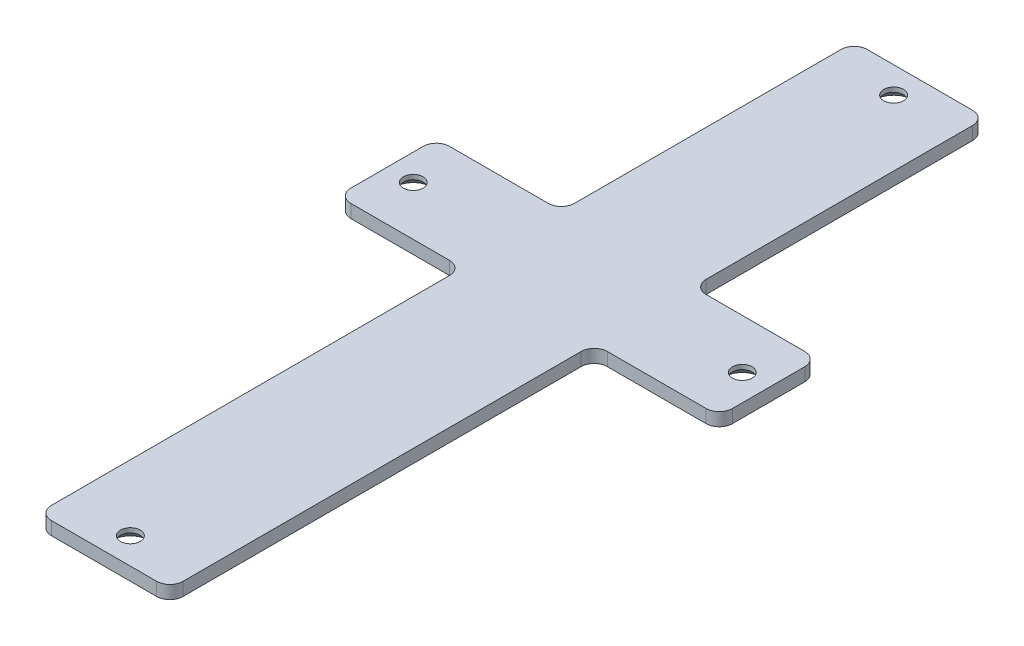
ISO-10303-21;
HEADER;
FILE_DESCRIPTION(('STEP AP214'),'2;1');
FILE_NAME('part.step','',(''),(''),'','','');
FILE_SCHEMA(('AUTOMOTIVE_DESIGN { 1 0 10303 214 1 1 1 1 }'));
ENDSEC;
DATA;
#1=APPLICATION_CONTEXT('core data for automotive mechanical design processes');
#2=APPLICATION_PROTOCOL_DEFINITION('international standard','automotive_design',2000,#1);
#3=PRODUCT_CONTEXT('',#1,'mechanical');
#4=PRODUCT('Part','Part','',(#3));
#5=PRODUCT_RELATED_PRODUCT_CATEGORY('part','',(#4));
#6=PRODUCT_DEFINITION_FORMATION('','',#4);
#7=PRODUCT_DEFINITION_CONTEXT('part definition',#1,'design');
#8=PRODUCT_DEFINITION('design','',#6,#7);
#9=PRODUCT_DEFINITION_SHAPE('','',#8);
#10=(LENGTH_UNIT() NAMED_UNIT(*) SI_UNIT(.MILLI.,.METRE.));
#11=(NAMED_UNIT(*) PLANE_ANGLE_UNIT() SI_UNIT($,.RADIAN.));
#12=(NAMED_UNIT(*) SI_UNIT($,.STERADIAN.) SOLID_ANGLE_UNIT());
#13=UNCERTAINTY_MEASURE_WITH_UNIT(LENGTH_MEASURE(1.E-05),#10,'distance_accuracy_value','');
#14=(GEOMETRIC_REPRESENTATION_CONTEXT(3) GLOBAL_UNCERTAINTY_ASSIGNED_CONTEXT((#13)) GLOBAL_UNIT_ASSIGNED_CONTEXT((#10,
#11,#12)) REPRESENTATION_CONTEXT('',''));
#15=CARTESIAN_POINT('',(0.,0.,0.));
#16=DIRECTION('',(0.,0.,1.));
#17=DIRECTION('',(1.,0.,0.));
#18=AXIS2_PLACEMENT_3D('',#15,#16,#17);
#19=CARTESIAN_POINT('',(0.,0.,0.));
#20=DIRECTION('',(0.,1.,0.));
#21=DIRECTION('',(0.,0.,1.));
#22=AXIS2_PLACEMENT_3D('',#19,#20,#21);
#23=PLANE('',#22);
#24=CARTESIAN_POINT('',(25.,0.,-10.));
#25=DIRECTION('',(0.,-1.,0.));
#26=DIRECTION('',(0.,0.,-1.));
#27=AXIS2_PLACEMENT_3D('',#24,#25,#26);
#28=CIRCLE('',#27,2.8);
#29=CARTESIAN_POINT('',(25.,0.,-12.8));
#30=VERTEX_POINT('',#29);
#31=EDGE_CURVE('E442',#30,#30,#28,.T.);
#32=ORIENTED_EDGE('',*,*,#31,.F.);
#33=EDGE_LOOP('',(#32));
#34=FACE_BOUND('',#33,.T.);
#35=CARTESIAN_POINT('',(0.,0.,-58.));
#36=DIRECTION('',(0.,-1.,0.));
#37=DIRECTION('',(0.,0.,-1.));
#38=AXIS2_PLACEMENT_3D('',#35,#36,#37);
#39=CIRCLE('',#38,2.8);
#40=CARTESIAN_POINT('',(0.,0.,-60.8));
#41=VERTEX_POINT('',#40);
#42=EDGE_CURVE('E424',#41,#41,#39,.T.);
#43=ORIENTED_EDGE('',*,*,#42,.F.);
#44=EDGE_LOOP('',(#43));
#45=FACE_BOUND('',#44,.T.);
#46=CARTESIAN_POINT('',(-12.,0.,-0.499999999999998));
#47=DIRECTION('',(0.,1.,0.));
#48=DIRECTION('',(0.,0.,1.));
#49=AXIS2_PLACEMENT_3D('',#46,#47,#48);
#50=CIRCLE('',#49,2.);
#51=CARTESIAN_POINT('',(-10.,0.,-0.499999999999984));
#52=VERTEX_POINT('',#51);
#53=CARTESIAN_POINT('',(-12.,0.,-2.5));
#54=VERTEX_POINT('',#53);
#55=EDGE_CURVE('E237',#52,#54,#50,.T.);
#56=ORIENTED_EDGE('',*,*,#55,.T.);
#57=DIRECTION('',(1.,0.,0.));
#58=VECTOR('',#57,1.);
#59=CARTESIAN_POINT('',(0.,0.,-2.5));
#60=LINE('',#59,#58);
#61=CARTESIAN_POINT('',(-27.,0.,-2.5));
#62=VERTEX_POINT('',#61);
#63=EDGE_CURVE('E297',#62,#54,#60,.T.);
#64=ORIENTED_EDGE('',*,*,#63,.F.);
#65=CARTESIAN_POINT('',(-27.,0.,-4.5));
#66=DIRECTION('',(0.,1.,0.));
#67=DIRECTION('',(0.,0.,1.));
#68=AXIS2_PLACEMENT_3D('',#65,#66,#67);
#69=CIRCLE('',#68,2.);
#70=CARTESIAN_POINT('',(-29.,0.,-4.50000000000001));
#71=VERTEX_POINT('',#70);
#72=EDGE_CURVE('E295',#62,#71,#69,.F.);
#73=ORIENTED_EDGE('',*,*,#72,.T.);
#74=DIRECTION('',(0.,0.,-1.));
#75=VECTOR('',#74,1.);
#76=CARTESIAN_POINT('',(-29.,0.,0.));
#77=LINE('',#76,#75);
#78=CARTESIAN_POINT('',(-29.,0.,-15.5));
#79=VERTEX_POINT('',#78);
#80=EDGE_CURVE('E205',#71,#79,#77,.T.);
#81=ORIENTED_EDGE('',*,*,#80,.T.);
#82=CARTESIAN_POINT('',(-27.,0.,-15.5));
#83=DIRECTION('',(0.,1.,0.));
#84=DIRECTION('',(0.,0.,1.));
#85=AXIS2_PLACEMENT_3D('',#82,#83,#84);
#86=CIRCLE('',#85,2.);
#87=CARTESIAN_POINT('',(-27.,0.,-17.5));
#88=VERTEX_POINT('',#87);
#89=EDGE_CURVE('E291',#79,#88,#86,.F.);
#90=ORIENTED_EDGE('',*,*,#89,.T.);
#91=DIRECTION('',(1.,0.,0.));
#92=VECTOR('',#91,1.);
#93=CARTESIAN_POINT('',(0.,0.,-17.5));
#94=LINE('',#93,#92);
#95=CARTESIAN_POINT('',(-12.,0.,-17.5));
#96=VERTEX_POINT('',#95);
#97=EDGE_CURVE('E288',#88,#96,#94,.T.);
#98=ORIENTED_EDGE('',*,*,#97,.T.);
#99=CARTESIAN_POINT('',(-12.,0.,-19.5));
#100=DIRECTION('',(0.,1.,0.));
#101=DIRECTION('',(0.,0.,1.));
#102=AXIS2_PLACEMENT_3D('',#99,#100,#101);
#103=CIRCLE('',#102,2.);
#104=CARTESIAN_POINT('',(-10.,0.,-19.5));
#105=VERTEX_POINT('',#104);
#106=EDGE_CURVE('E285',#96,#105,#103,.T.);
#107=ORIENTED_EDGE('',*,*,#106,.T.);
#108=DIRECTION('',(0.,0.,-1.));
#109=VECTOR('',#108,1.);
#110=CARTESIAN_POINT('',(-10.,0.,0.));
#111=LINE('',#110,#109);
#112=CARTESIAN_POINT('',(-10.,0.,-60.));
#113=VERTEX_POINT('',#112);
#114=EDGE_CURVE('E282',#105,#113,#111,.T.);
#115=ORIENTED_EDGE('',*,*,#114,.T.);
#116=CARTESIAN_POINT('',(-8.,0.,-60.));
#117=DIRECTION('',(0.,1.,0.));
#118=DIRECTION('',(0.,0.,1.));
#119=AXIS2_PLACEMENT_3D('',#116,#117,#118);
#120=CIRCLE('',#119,2.);
#121=CARTESIAN_POINT('',(-7.99999999999998,0.,-62.));
#122=VERTEX_POINT('',#121);
#123=EDGE_CURVE('E279',#113,#122,#120,.F.);
#124=ORIENTED_EDGE('',*,*,#123,.T.);
#125=DIRECTION('',(1.,0.,0.));
#126=VECTOR('',#125,1.);
#127=CARTESIAN_POINT('',(0.,0.,-62.));
#128=LINE('',#127,#126);
#129=CARTESIAN_POINT('',(7.99999999999999,0.,-62.));
#130=VERTEX_POINT('',#129);
#131=EDGE_CURVE('E276',#122,#130,#128,.T.);
#132=ORIENTED_EDGE('',*,*,#131,.T.);
#133=CARTESIAN_POINT('',(8.,0.,-60.));
#134=DIRECTION('',(0.,1.,0.));
#135=DIRECTION('',(0.,0.,1.));
#136=AXIS2_PLACEMENT_3D('',#133,#134,#135);
#137=CIRCLE('',#136,2.);
#138=CARTESIAN_POINT('',(10.,0.,-60.));
#139=VERTEX_POINT('',#138);
#140=EDGE_CURVE('E273',#130,#139,#137,.F.);
#141=ORIENTED_EDGE('',*,*,#140,.T.);
#142=DIRECTION('',(0.,0.,-1.));
#143=VECTOR('',#142,1.);
#144=CARTESIAN_POINT('',(10.,0.,0.));
#145=LINE('',#144,#143);
#146=CARTESIAN_POINT('',(10.,0.,-19.5));
#147=VERTEX_POINT('',#146);
#148=EDGE_CURVE('E270',#147,#139,#145,.T.);
#149=ORIENTED_EDGE('',*,*,#148,.F.);
#150=CARTESIAN_POINT('',(12.,0.,-19.5));
#151=DIRECTION('',(0.,1.,0.));
#152=DIRECTION('',(0.,0.,1.));
#153=AXIS2_PLACEMENT_3D('',#150,#151,#152);
#154=CIRCLE('',#153,2.);
#155=CARTESIAN_POINT('',(12.,0.,-17.5));
#156=VERTEX_POINT('',#155);
#157=EDGE_CURVE('E268',#156,#147,#154,.F.);
#158=ORIENTED_EDGE('',*,*,#157,.F.);
#159=DIRECTION('',(1.,0.,0.));
#160=VECTOR('',#159,1.);
#161=CARTESIAN_POINT('',(0.,0.,-17.5));
#162=LINE('',#161,#160);
#163=CARTESIAN_POINT('',(27.,0.,-17.5));
#164=VERTEX_POINT('',#163);
#165=EDGE_CURVE('E265',#156,#164,#162,.T.);
#166=ORIENTED_EDGE('',*,*,#165,.T.);
#167=CARTESIAN_POINT('',(27.,0.,-15.5));
#168=DIRECTION('',(0.,1.,0.));
#169=DIRECTION('',(0.,0.,1.));
#170=AXIS2_PLACEMENT_3D('',#167,#168,#169);
#171=CIRCLE('',#170,2.);
#172=CARTESIAN_POINT('',(29.,0.,-15.5));
#173=VERTEX_POINT('',#172);
#174=EDGE_CURVE('E262',#164,#173,#171,.F.);
#175=ORIENTED_EDGE('',*,*,#174,.T.);
#176=DIRECTION('',(0.,0.,-1.));
#177=VECTOR('',#176,1.);
#178=CARTESIAN_POINT('',(29.,0.,0.));
#179=LINE('',#178,#177);
#180=CARTESIAN_POINT('',(29.,0.,-4.50000000000001));
#181=VERTEX_POINT('',#180);
#182=EDGE_CURVE('E259',#181,#173,#179,.T.);
#183=ORIENTED_EDGE('',*,*,#182,.F.);
#184=CARTESIAN_POINT('',(27.,0.,-4.5));
#185=DIRECTION('',(0.,1.,0.));
#186=DIRECTION('',(0.,0.,1.));
#187=AXIS2_PLACEMENT_3D('',#184,#185,#186);
#188=CIRCLE('',#187,2.);
#189=CARTESIAN_POINT('',(27.,0.,-2.5));
#190=VERTEX_POINT('',#189);
#191=EDGE_CURVE('E257',#190,#181,#188,.T.);
#192=ORIENTED_EDGE('',*,*,#191,.F.);
#193=DIRECTION('',(1.,0.,0.));
#194=VECTOR('',#193,1.);
#195=CARTESIAN_POINT('',(0.,0.,-2.5));
#196=LINE('',#195,#194);
#197=CARTESIAN_POINT('',(12.,0.,-2.5));
#198=VERTEX_POINT('',#197);
#199=EDGE_CURVE('E255',#198,#190,#196,.T.);
#200=ORIENTED_EDGE('',*,*,#199,.F.);
#201=CARTESIAN_POINT('',(12.,0.,-0.499999999999998));
#202=DIRECTION('',(0.,1.,0.));
#203=DIRECTION('',(0.,0.,1.));
#204=AXIS2_PLACEMENT_3D('',#201,#202,#203);
#205=CIRCLE('',#204,2.);
#206=CARTESIAN_POINT('',(10.,0.,-0.499999999999984));
#207=VERTEX_POINT('',#206);
#208=EDGE_CURVE('E253',#207,#198,#205,.F.);
#209=ORIENTED_EDGE('',*,*,#208,.F.);
#210=DIRECTION('',(0.,0.,-1.));
#211=VECTOR('',#210,1.);
#212=CARTESIAN_POINT('',(10.,0.,0.));
#213=LINE('',#212,#211);
#214=CARTESIAN_POINT('',(10.,0.,60.));
#215=VERTEX_POINT('',#214);
#216=EDGE_CURVE('E251',#215,#207,#213,.T.);
#217=ORIENTED_EDGE('',*,*,#216,.F.);
#218=CARTESIAN_POINT('',(8.,0.,60.));
#219=DIRECTION('',(0.,1.,0.));
#220=DIRECTION('',(0.,0.,1.));
#221=AXIS2_PLACEMENT_3D('',#218,#219,#220);
#222=CIRCLE('',#221,2.);
#223=CARTESIAN_POINT('',(7.99999999999999,0.,62.));
#224=VERTEX_POINT('',#223);
#225=EDGE_CURVE('E249',#224,#215,#222,.T.);
#226=ORIENTED_EDGE('',*,*,#225,.F.);
#227=DIRECTION('',(1.,0.,0.));
#228=VECTOR('',#227,1.);
#229=CARTESIAN_POINT('',(0.,0.,62.));
#230=LINE('',#229,#228);
#231=CARTESIAN_POINT('',(-7.99999999999998,0.,62.));
#232=VERTEX_POINT('',#231);
#233=EDGE_CURVE('E247',#232,#224,#230,.T.);
#234=ORIENTED_EDGE('',*,*,#233,.F.);
#235=CARTESIAN_POINT('',(-8.,0.,60.));
#236=DIRECTION('',(0.,1.,0.));
#237=DIRECTION('',(0.,0.,1.));
#238=AXIS2_PLACEMENT_3D('',#235,#236,#237);
#239=CIRCLE('',#238,2.);
#240=CARTESIAN_POINT('',(-10.,0.,60.));
#241=VERTEX_POINT('',#240);
#242=EDGE_CURVE('E244',#232,#241,#239,.F.);
#243=ORIENTED_EDGE('',*,*,#242,.T.);
#244=DIRECTION('',(0.,0.,-1.));
#245=VECTOR('',#244,1.);
#246=CARTESIAN_POINT('',(-10.,0.,0.));
#247=LINE('',#246,#245);
#248=EDGE_CURVE('E240',#241,#52,#247,.T.);
#249=ORIENTED_EDGE('',*,*,#248,.T.);
#250=EDGE_LOOP('',(#56,#64,#73,#81,#90,#98,#107,#115,#124,#132,#141,#149,#158,#166,#175,#183,
#192,#200,#209,#217,#226,#234,#243,#249));
#251=FACE_BOUND('',#250,.T.);
#252=CARTESIAN_POINT('',(0.,0.,58.));
#253=DIRECTION('',(0.,-1.,0.));
#254=DIRECTION('',(0.,0.,-1.));
#255=AXIS2_PLACEMENT_3D('',#252,#253,#254);
#256=CIRCLE('',#255,2.8);
#257=CARTESIAN_POINT('',(0.,0.,55.2));
#258=VERTEX_POINT('',#257);
#259=EDGE_CURVE('E430',#258,#258,#256,.T.);
#260=ORIENTED_EDGE('',*,*,#259,.F.);
#261=EDGE_LOOP('',(#260));
#262=FACE_BOUND('',#261,.T.);
#263=CARTESIAN_POINT('',(-25.,0.,-10.));
#264=DIRECTION('',(0.,-1.,0.));
#265=DIRECTION('',(0.,0.,-1.));
#266=AXIS2_PLACEMENT_3D('',#263,#264,#265);
#267=CIRCLE('',#266,2.8);
#268=CARTESIAN_POINT('',(-25.,0.,-12.8));
#269=VERTEX_POINT('',#268);
#270=EDGE_CURVE('E436',#269,#269,#267,.T.);
#271=ORIENTED_EDGE('',*,*,#270,.F.);
#272=EDGE_LOOP('',(#271));
#273=FACE_BOUND('',#272,.T.);
#274=ADVANCED_FACE('F34',(#34,#45,#251,#262,#273),#23,.F.);
#275=CARTESIAN_POINT('',(-12.,2.,-0.499999999999998));
#276=DIRECTION('',(0.,-1.,0.));
#277=DIRECTION('',(0.,0.,-1.));
#278=AXIS2_PLACEMENT_3D('',#275,#276,#277);
#279=CYLINDRICAL_SURFACE('',#278,2.);
#280=ORIENTED_EDGE('',*,*,#55,.F.);
#281=DIRECTION('',(0.,-1.,0.));
#282=VECTOR('',#281,1.);
#283=CARTESIAN_POINT('',(-10.,2.,-0.499999999999984));
#284=LINE('',#283,#282);
#285=CARTESIAN_POINT('',(-10.,2.,-0.499999999999984));
#286=VERTEX_POINT('',#285);
#287=EDGE_CURVE('E11',#286,#52,#284,.T.);
#288=ORIENTED_EDGE('',*,*,#287,.F.);
#289=CARTESIAN_POINT('',(-12.,2.,-0.499999999999998));
#290=DIRECTION('',(0.,1.,0.));
#291=DIRECTION('',(0.,0.,1.));
#292=AXIS2_PLACEMENT_3D('',#289,#290,#291);
#293=CIRCLE('',#292,2.);
#294=CARTESIAN_POINT('',(-12.,2.,-2.5));
#295=VERTEX_POINT('',#294);
#296=EDGE_CURVE('E299',#286,#295,#293,.T.);
#297=ORIENTED_EDGE('',*,*,#296,.T.);
#298=DIRECTION('',(0.,-1.,0.));
#299=VECTOR('',#298,1.);
#300=CARTESIAN_POINT('',(-12.,2.,-2.5));
#301=LINE('',#300,#299);
#302=EDGE_CURVE('E133',#295,#54,#301,.T.);
#303=ORIENTED_EDGE('',*,*,#302,.T.);
#304=EDGE_LOOP('',(#280,#288,#297,#303));
#305=FACE_BOUND('',#304,.T.);
#306=ADVANCED_FACE('F36',(#305),#279,.F.);
#307=CARTESIAN_POINT('',(-10.,2.,0.));
#308=DIRECTION('',(-1.,0.,0.));
#309=DIRECTION('',(0.,0.,1.));
#310=AXIS2_PLACEMENT_3D('',#307,#308,#309);
#311=PLANE('',#310);
#312=ORIENTED_EDGE('',*,*,#248,.F.);
#313=DIRECTION('',(0.,-1.,0.));
#314=VECTOR('',#313,1.);
#315=CARTESIAN_POINT('',(-10.,2.,60.));
#316=LINE('',#315,#314);
#317=CARTESIAN_POINT('',(-10.,2.,60.));
#318=VERTEX_POINT('',#317);
#319=EDGE_CURVE('E43',#318,#241,#316,.T.);
#320=ORIENTED_EDGE('',*,*,#319,.F.);
#321=DIRECTION('',(0.,0.,-1.));
#322=VECTOR('',#321,1.);
#323=CARTESIAN_POINT('',(-10.,2.,0.));
#324=LINE('',#323,#322);
#325=EDGE_CURVE('E418',#318,#286,#324,.T.);
#326=ORIENTED_EDGE('',*,*,#325,.T.);
#327=ORIENTED_EDGE('',*,*,#287,.T.);
#328=EDGE_LOOP('',(#312,#320,#326,#327));
#329=FACE_BOUND('',#328,.T.);
#330=ADVANCED_FACE('F355',(#329),#311,.T.);
#331=CARTESIAN_POINT('',(-8.,2.,60.));
#332=DIRECTION('',(0.,-1.,0.));
#333=DIRECTION('',(0.,0.,-1.));
#334=AXIS2_PLACEMENT_3D('',#331,#332,#333);
#335=CYLINDRICAL_SURFACE('',#334,2.);
#336=ORIENTED_EDGE('',*,*,#242,.F.);
#337=DIRECTION('',(0.,-1.,0.));
#338=VECTOR('',#337,1.);
#339=CARTESIAN_POINT('',(-7.99999999999998,2.,62.));
#340=LINE('',#339,#338);
#341=CARTESIAN_POINT('',(-7.99999999999998,2.,62.));
#342=VERTEX_POINT('',#341);
#343=EDGE_CURVE('E344',#342,#232,#340,.T.);
#344=ORIENTED_EDGE('',*,*,#343,.F.);
#345=CARTESIAN_POINT('',(-8.,2.,60.));
#346=DIRECTION('',(0.,1.,0.));
#347=DIRECTION('',(0.,0.,1.));
#348=AXIS2_PLACEMENT_3D('',#345,#346,#347);
#349=CIRCLE('',#348,2.);
#350=EDGE_CURVE('E351',#342,#318,#349,.F.);
#351=ORIENTED_EDGE('',*,*,#350,.T.);
#352=ORIENTED_EDGE('',*,*,#319,.T.);
#353=EDGE_LOOP('',(#336,#344,#351,#352));
#354=FACE_BOUND('',#353,.T.);
#355=ADVANCED_FACE('F349',(#354),#335,.T.);
#356=CARTESIAN_POINT('',(0.,2.,62.));
#357=DIRECTION('',(0.,0.,-1.));
#358=DIRECTION('',(-1.,0.,0.));
#359=AXIS2_PLACEMENT_3D('',#356,#357,#358);
#360=PLANE('',#359);
#361=ORIENTED_EDGE('',*,*,#233,.T.);
#362=DIRECTION('',(0.,-1.,0.));
#363=VECTOR('',#362,1.);
#364=CARTESIAN_POINT('',(7.99999999999999,2.,62.));
#365=LINE('',#364,#363);
#366=CARTESIAN_POINT('',(7.99999999999999,2.,62.));
#367=VERTEX_POINT('',#366);
#368=EDGE_CURVE('E341',#367,#224,#365,.T.);
#369=ORIENTED_EDGE('',*,*,#368,.F.);
#370=DIRECTION('',(1.,0.,0.));
#371=VECTOR('',#370,1.);
#372=CARTESIAN_POINT('',(0.,2.,62.));
#373=LINE('',#372,#371);
#374=EDGE_CURVE('E372',#342,#367,#373,.T.);
#375=ORIENTED_EDGE('',*,*,#374,.F.);
#376=ORIENTED_EDGE('',*,*,#343,.T.);
#377=EDGE_LOOP('',(#361,#369,#375,#376));
#378=FACE_BOUND('',#377,.T.);
#379=ADVANCED_FACE('F363',(#378),#360,.F.);
#380=CARTESIAN_POINT('',(8.,2.,60.));
#381=DIRECTION('',(0.,-1.,0.));
#382=DIRECTION('',(0.,0.,-1.));
#383=AXIS2_PLACEMENT_3D('',#380,#381,#382);
#384=CYLINDRICAL_SURFACE('',#383,2.);
#385=ORIENTED_EDGE('',*,*,#225,.T.);
#386=DIRECTION('',(0.,-1.,0.));
#387=VECTOR('',#386,1.);
#388=CARTESIAN_POINT('',(10.,2.,60.));
#389=LINE('',#388,#387);
#390=CARTESIAN_POINT('',(10.,2.,60.));
#391=VERTEX_POINT('',#390);
#392=EDGE_CURVE('E338',#391,#215,#389,.T.);
#393=ORIENTED_EDGE('',*,*,#392,.F.);
#394=CARTESIAN_POINT('',(8.,2.,60.));
#395=DIRECTION('',(0.,1.,0.));
#396=DIRECTION('',(0.,0.,1.));
#397=AXIS2_PLACEMENT_3D('',#394,#395,#396);
#398=CIRCLE('',#397,2.);
#399=EDGE_CURVE('E369',#367,#391,#398,.T.);
#400=ORIENTED_EDGE('',*,*,#399,.F.);
#401=ORIENTED_EDGE('',*,*,#368,.T.);
#402=EDGE_LOOP('',(#385,#393,#400,#401));
#403=FACE_BOUND('',#402,.T.);
#404=ADVANCED_FACE('F367',(#403),#384,.T.);
#405=CARTESIAN_POINT('',(10.,2.,0.));
#406=DIRECTION('',(-1.,0.,0.));
#407=DIRECTION('',(0.,0.,1.));
#408=AXIS2_PLACEMENT_3D('',#405,#406,#407);
#409=PLANE('',#408);
#410=ORIENTED_EDGE('',*,*,#216,.T.);
#411=DIRECTION('',(0.,-1.,0.));
#412=VECTOR('',#411,1.);
#413=CARTESIAN_POINT('',(10.,2.,-0.499999999999984));
#414=LINE('',#413,#412);
#415=CARTESIAN_POINT('',(10.,2.,-0.499999999999984));
#416=VERTEX_POINT('',#415);
#417=EDGE_CURVE('E335',#416,#207,#414,.T.);
#418=ORIENTED_EDGE('',*,*,#417,.F.);
#419=DIRECTION('',(0.,0.,-1.));
#420=VECTOR('',#419,1.);
#421=CARTESIAN_POINT('',(10.,2.,0.));
#422=LINE('',#421,#420);
#423=EDGE_CURVE('E371',#391,#416,#422,.T.);
#424=ORIENTED_EDGE('',*,*,#423,.F.);
#425=ORIENTED_EDGE('',*,*,#392,.T.);
#426=EDGE_LOOP('',(#410,#418,#424,#425));
#427=FACE_BOUND('',#426,.T.);
#428=ADVANCED_FACE('F548',(#427),#409,.F.);
#429=CARTESIAN_POINT('',(12.,2.,-0.499999999999998));
#430=DIRECTION('',(0.,-1.,0.));
#431=DIRECTION('',(0.,0.,-1.));
#432=AXIS2_PLACEMENT_3D('',#429,#430,#431);
#433=CYLINDRICAL_SURFACE('',#432,2.);
#434=ORIENTED_EDGE('',*,*,#208,.T.);
#435=DIRECTION('',(0.,-1.,0.));
#436=VECTOR('',#435,1.);
#437=CARTESIAN_POINT('',(12.,2.,-2.5));
#438=LINE('',#437,#436);
#439=CARTESIAN_POINT('',(12.,2.,-2.5));
#440=VERTEX_POINT('',#439);
#441=EDGE_CURVE('E332',#440,#198,#438,.T.);
#442=ORIENTED_EDGE('',*,*,#441,.F.);
#443=CARTESIAN_POINT('',(12.,2.,-0.499999999999998));
#444=DIRECTION('',(0.,1.,0.));
#445=DIRECTION('',(0.,0.,1.));
#446=AXIS2_PLACEMENT_3D('',#443,#444,#445);
#447=CIRCLE('',#446,2.);
#448=EDGE_CURVE('E374',#416,#440,#447,.F.);
#449=ORIENTED_EDGE('',*,*,#448,.F.);
#450=ORIENTED_EDGE('',*,*,#417,.T.);
#451=EDGE_LOOP('',(#434,#442,#449,#450));
#452=FACE_BOUND('',#451,.T.);
#453=ADVANCED_FACE('F544',(#452),#433,.F.);
#454=CARTESIAN_POINT('',(0.,2.,-2.5));
#455=DIRECTION('',(0.,0.,-1.));
#456=DIRECTION('',(-1.,0.,0.));
#457=AXIS2_PLACEMENT_3D('',#454,#455,#456);
#458=PLANE('',#457);
#459=ORIENTED_EDGE('',*,*,#199,.T.);
#460=DIRECTION('',(0.,-1.,0.));
#461=VECTOR('',#460,1.);
#462=CARTESIAN_POINT('',(27.,2.,-2.5));
#463=LINE('',#462,#461);
#464=CARTESIAN_POINT('',(27.,2.,-2.5));
#465=VERTEX_POINT('',#464);
#466=EDGE_CURVE('E329',#465,#190,#463,.T.);
#467=ORIENTED_EDGE('',*,*,#466,.F.);
#468=DIRECTION('',(1.,0.,0.));
#469=VECTOR('',#468,1.);
#470=CARTESIAN_POINT('',(0.,2.,-2.5));
#471=LINE('',#470,#469);
#472=EDGE_CURVE('E380',#440,#465,#471,.T.);
#473=ORIENTED_EDGE('',*,*,#472,.F.);
#474=ORIENTED_EDGE('',*,*,#441,.T.);
#475=EDGE_LOOP('',(#459,#467,#473,#474));
#476=FACE_BOUND('',#475,.T.);
#477=ADVANCED_FACE('F540',(#476),#458,.F.);
#478=CARTESIAN_POINT('',(27.,2.,-4.5));
#479=DIRECTION('',(0.,-1.,0.));
#480=DIRECTION('',(0.,0.,-1.));
#481=AXIS2_PLACEMENT_3D('',#478,#479,#480);
#482=CYLINDRICAL_SURFACE('',#481,2.);
#483=ORIENTED_EDGE('',*,*,#191,.T.);
#484=DIRECTION('',(0.,-1.,0.));
#485=VECTOR('',#484,1.);
#486=CARTESIAN_POINT('',(29.,2.,-4.50000000000001));
#487=LINE('',#486,#485);
#488=CARTESIAN_POINT('',(29.,2.,-4.50000000000001));
#489=VERTEX_POINT('',#488);
#490=EDGE_CURVE('E326',#489,#181,#487,.T.);
#491=ORIENTED_EDGE('',*,*,#490,.F.);
#492=CARTESIAN_POINT('',(27.,2.,-4.5));
#493=DIRECTION('',(0.,1.,0.));
#494=DIRECTION('',(0.,0.,1.));
#495=AXIS2_PLACEMENT_3D('',#492,#493,#494);
#496=CIRCLE('',#495,2.);
#497=EDGE_CURVE('E382',#465,#489,#496,.T.);
#498=ORIENTED_EDGE('',*,*,#497,.F.);
#499=ORIENTED_EDGE('',*,*,#466,.T.);
#500=EDGE_LOOP('',(#483,#491,#498,#499));
#501=FACE_BOUND('',#500,.T.);
#502=ADVANCED_FACE('F536',(#501),#482,.T.);
#503=CARTESIAN_POINT('',(29.,2.,0.));
#504=DIRECTION('',(-1.,0.,0.));
#505=DIRECTION('',(0.,0.,1.));
#506=AXIS2_PLACEMENT_3D('',#503,#504,#505);
#507=PLANE('',#506);
#508=ORIENTED_EDGE('',*,*,#182,.T.);
#509=DIRECTION('',(0.,-1.,0.));
#510=VECTOR('',#509,1.);
#511=CARTESIAN_POINT('',(29.,2.,-15.5));
#512=LINE('',#511,#510);
#513=CARTESIAN_POINT('',(29.,2.,-15.5));
#514=VERTEX_POINT('',#513);
#515=EDGE_CURVE('E324',#514,#173,#512,.T.);
#516=ORIENTED_EDGE('',*,*,#515,.F.);
#517=DIRECTION('',(0.,0.,-1.));
#518=VECTOR('',#517,1.);
#519=CARTESIAN_POINT('',(29.,2.,0.));
#520=LINE('',#519,#518);
#521=EDGE_CURVE('E384',#489,#514,#520,.T.);
#522=ORIENTED_EDGE('',*,*,#521,.F.);
#523=ORIENTED_EDGE('',*,*,#490,.T.);
#524=EDGE_LOOP('',(#508,#516,#522,#523));
#525=FACE_BOUND('',#524,.T.);
#526=ADVANCED_FACE('F532',(#525),#507,.F.);
#527=CARTESIAN_POINT('',(27.,2.,-15.5));
#528=DIRECTION('',(0.,-1.,0.));
#529=DIRECTION('',(0.,0.,-1.));
#530=AXIS2_PLACEMENT_3D('',#527,#528,#529);
#531=CYLINDRICAL_SURFACE('',#530,2.);
#532=ORIENTED_EDGE('',*,*,#174,.F.);
#533=DIRECTION('',(0.,-1.,0.));
#534=VECTOR('',#533,1.);
#535=CARTESIAN_POINT('',(27.,2.,-17.5));
#536=LINE('',#535,#534);
#537=CARTESIAN_POINT('',(27.,2.,-17.5));
#538=VERTEX_POINT('',#537);
#539=EDGE_CURVE('E322',#538,#164,#536,.T.);
#540=ORIENTED_EDGE('',*,*,#539,.F.);
#541=CARTESIAN_POINT('',(27.,2.,-15.5));
#542=DIRECTION('',(0.,1.,0.));
#543=DIRECTION('',(0.,0.,1.));
#544=AXIS2_PLACEMENT_3D('',#541,#542,#543);
#545=CIRCLE('',#544,2.);
#546=EDGE_CURVE('E386',#538,#514,#545,.F.);
#547=ORIENTED_EDGE('',*,*,#546,.T.);
#548=ORIENTED_EDGE('',*,*,#515,.T.);
#549=EDGE_LOOP('',(#532,#540,#547,#548));
#550=FACE_BOUND('',#549,.T.);
#551=ADVANCED_FACE('F528',(#550),#531,.T.);
#552=CARTESIAN_POINT('',(0.,2.,-17.5));
#553=DIRECTION('',(0.,0.,-1.));
#554=DIRECTION('',(-1.,0.,0.));
#555=AXIS2_PLACEMENT_3D('',#552,#553,#554);
#556=PLANE('',#555);
#557=ORIENTED_EDGE('',*,*,#165,.F.);
#558=DIRECTION('',(0.,-1.,0.));
#559=VECTOR('',#558,1.);
#560=CARTESIAN_POINT('',(12.,2.,-17.5));
#561=LINE('',#560,#559);
#562=CARTESIAN_POINT('',(12.,2.,-17.5));
#563=VERTEX_POINT('',#562);
#564=EDGE_CURVE('E320',#563,#156,#561,.T.);
#565=ORIENTED_EDGE('',*,*,#564,.F.);
#566=DIRECTION('',(1.,0.,0.));
#567=VECTOR('',#566,1.);
#568=CARTESIAN_POINT('',(0.,2.,-17.5));
#569=LINE('',#568,#567);
#570=EDGE_CURVE('E389',#563,#538,#569,.T.);
#571=ORIENTED_EDGE('',*,*,#570,.T.);
#572=ORIENTED_EDGE('',*,*,#539,.T.);
#573=EDGE_LOOP('',(#557,#565,#571,#572));
#574=FACE_BOUND('',#573,.T.);
#575=ADVANCED_FACE('F524',(#574),#556,.T.);
#576=CARTESIAN_POINT('',(12.,2.,-19.5));
#577=DIRECTION('',(0.,-1.,0.));
#578=DIRECTION('',(0.,0.,-1.));
#579=AXIS2_PLACEMENT_3D('',#576,#577,#578);
#580=CYLINDRICAL_SURFACE('',#579,2.);
#581=ORIENTED_EDGE('',*,*,#157,.T.);
#582=DIRECTION('',(0.,-1.,0.));
#583=VECTOR('',#582,1.);
#584=CARTESIAN_POINT('',(10.,2.,-19.5));
#585=LINE('',#584,#583);
#586=CARTESIAN_POINT('',(10.,2.,-19.5));
#587=VERTEX_POINT('',#586);
#588=EDGE_CURVE('E317',#587,#147,#585,.T.);
#589=ORIENTED_EDGE('',*,*,#588,.F.);
#590=CARTESIAN_POINT('',(12.,2.,-19.5));
#591=DIRECTION('',(0.,1.,0.));
#592=DIRECTION('',(0.,0.,1.));
#593=AXIS2_PLACEMENT_3D('',#590,#591,#592);
#594=CIRCLE('',#593,2.);
#595=EDGE_CURVE('E392',#563,#587,#594,.F.);
#596=ORIENTED_EDGE('',*,*,#595,.F.);
#597=ORIENTED_EDGE('',*,*,#564,.T.);
#598=EDGE_LOOP('',(#581,#589,#596,#597));
#599=FACE_BOUND('',#598,.T.);
#600=ADVANCED_FACE('F520',(#599),#580,.F.);
#601=CARTESIAN_POINT('',(10.,2.,0.));
#602=DIRECTION('',(-1.,0.,0.));
#603=DIRECTION('',(0.,0.,1.));
#604=AXIS2_PLACEMENT_3D('',#601,#602,#603);
#605=PLANE('',#604);
#606=ORIENTED_EDGE('',*,*,#148,.T.);
#607=DIRECTION('',(0.,-1.,0.));
#608=VECTOR('',#607,1.);
#609=CARTESIAN_POINT('',(10.,2.,-60.));
#610=LINE('',#609,#608);
#611=CARTESIAN_POINT('',(10.,2.,-60.));
#612=VERTEX_POINT('',#611);
#613=EDGE_CURVE('E315',#612,#139,#610,.T.);
#614=ORIENTED_EDGE('',*,*,#613,.F.);
#615=DIRECTION('',(0.,0.,-1.));
#616=VECTOR('',#615,1.);
#617=CARTESIAN_POINT('',(10.,2.,0.));
#618=LINE('',#617,#616);
#619=EDGE_CURVE('E394',#587,#612,#618,.T.);
#620=ORIENTED_EDGE('',*,*,#619,.F.);
#621=ORIENTED_EDGE('',*,*,#588,.T.);
#622=EDGE_LOOP('',(#606,#614,#620,#621));
#623=FACE_BOUND('',#622,.T.);
#624=ADVANCED_FACE('F516',(#623),#605,.F.);
#625=CARTESIAN_POINT('',(8.,2.,-60.));
#626=DIRECTION('',(0.,-1.,0.));
#627=DIRECTION('',(0.,0.,-1.));
#628=AXIS2_PLACEMENT_3D('',#625,#626,#627);
#629=CYLINDRICAL_SURFACE('',#628,2.);
#630=ORIENTED_EDGE('',*,*,#140,.F.);
#631=DIRECTION('',(0.,-1.,0.));
#632=VECTOR('',#631,1.);
#633=CARTESIAN_POINT('',(7.99999999999999,2.,-62.));
#634=LINE('',#633,#632);
#635=CARTESIAN_POINT('',(7.99999999999999,2.,-62.));
#636=VERTEX_POINT('',#635);
#637=EDGE_CURVE('E313',#636,#130,#634,.T.);
#638=ORIENTED_EDGE('',*,*,#637,.F.);
#639=CARTESIAN_POINT('',(8.,2.,-60.));
#640=DIRECTION('',(0.,1.,0.));
#641=DIRECTION('',(0.,0.,1.));
#642=AXIS2_PLACEMENT_3D('',#639,#640,#641);
#643=CIRCLE('',#642,2.);
#644=EDGE_CURVE('E396',#636,#612,#643,.F.);
#645=ORIENTED_EDGE('',*,*,#644,.T.);
#646=ORIENTED_EDGE('',*,*,#613,.T.);
#647=EDGE_LOOP('',(#630,#638,#645,#646));
#648=FACE_BOUND('',#647,.T.);
#649=ADVANCED_FACE('F512',(#648),#629,.T.);
#650=CARTESIAN_POINT('',(0.,2.,-62.));
#651=DIRECTION('',(0.,0.,-1.));
#652=DIRECTION('',(-1.,0.,0.));
#653=AXIS2_PLACEMENT_3D('',#650,#651,#652);
#654=PLANE('',#653);
#655=ORIENTED_EDGE('',*,*,#131,.F.);
#656=DIRECTION('',(0.,-1.,0.));
#657=VECTOR('',#656,1.);
#658=CARTESIAN_POINT('',(-7.99999999999998,2.,-62.));
#659=LINE('',#658,#657);
#660=CARTESIAN_POINT('',(-7.99999999999998,2.,-62.));
#661=VERTEX_POINT('',#660);
#662=EDGE_CURVE('E311',#661,#122,#659,.T.);
#663=ORIENTED_EDGE('',*,*,#662,.F.);
#664=DIRECTION('',(1.,0.,0.));
#665=VECTOR('',#664,1.);
#666=CARTESIAN_POINT('',(0.,2.,-62.));
#667=LINE('',#666,#665);
#668=EDGE_CURVE('E399',#661,#636,#667,.T.);
#669=ORIENTED_EDGE('',*,*,#668,.T.);
#670=ORIENTED_EDGE('',*,*,#637,.T.);
#671=EDGE_LOOP('',(#655,#663,#669,#670));
#672=FACE_BOUND('',#671,.T.);
#673=ADVANCED_FACE('F508',(#672),#654,.T.);
#674=CARTESIAN_POINT('',(-8.,2.,-60.));
#675=DIRECTION('',(0.,-1.,0.));
#676=DIRECTION('',(0.,0.,-1.));
#677=AXIS2_PLACEMENT_3D('',#674,#675,#676);
#678=CYLINDRICAL_SURFACE('',#677,2.);
#679=ORIENTED_EDGE('',*,*,#123,.F.);
#680=DIRECTION('',(0.,-1.,0.));
#681=VECTOR('',#680,1.);
#682=CARTESIAN_POINT('',(-10.,2.,-60.));
#683=LINE('',#682,#681);
#684=CARTESIAN_POINT('',(-10.,2.,-60.));
#685=VERTEX_POINT('',#684);
#686=EDGE_CURVE('E309',#685,#113,#683,.T.);
#687=ORIENTED_EDGE('',*,*,#686,.F.);
#688=CARTESIAN_POINT('',(-8.,2.,-60.));
#689=DIRECTION('',(0.,1.,0.));
#690=DIRECTION('',(0.,0.,1.));
#691=AXIS2_PLACEMENT_3D('',#688,#689,#690);
#692=CIRCLE('',#691,2.);
#693=EDGE_CURVE('E402',#685,#661,#692,.F.);
#694=ORIENTED_EDGE('',*,*,#693,.T.);
#695=ORIENTED_EDGE('',*,*,#662,.T.);
#696=EDGE_LOOP('',(#679,#687,#694,#695));
#697=FACE_BOUND('',#696,.T.);
#698=ADVANCED_FACE('F504',(#697),#678,.T.);
#699=CARTESIAN_POINT('',(-10.,2.,0.));
#700=DIRECTION('',(-1.,0.,0.));
#701=DIRECTION('',(0.,0.,1.));
#702=AXIS2_PLACEMENT_3D('',#699,#700,#701);
#703=PLANE('',#702);
#704=ORIENTED_EDGE('',*,*,#114,.F.);
#705=DIRECTION('',(0.,-1.,0.));
#706=VECTOR('',#705,1.);
#707=CARTESIAN_POINT('',(-10.,2.,-19.5));
#708=LINE('',#707,#706);
#709=CARTESIAN_POINT('',(-10.,2.,-19.5));
#710=VERTEX_POINT('',#709);
#711=EDGE_CURVE('E307',#710,#105,#708,.T.);
#712=ORIENTED_EDGE('',*,*,#711,.F.);
#713=DIRECTION('',(0.,0.,-1.));
#714=VECTOR('',#713,1.);
#715=CARTESIAN_POINT('',(-10.,2.,0.));
#716=LINE('',#715,#714);
#717=EDGE_CURVE('E405',#710,#685,#716,.T.);
#718=ORIENTED_EDGE('',*,*,#717,.T.);
#719=ORIENTED_EDGE('',*,*,#686,.T.);
#720=EDGE_LOOP('',(#704,#712,#718,#719));
#721=FACE_BOUND('',#720,.T.);
#722=ADVANCED_FACE('F500',(#721),#703,.T.);
#723=CARTESIAN_POINT('',(-12.,2.,-19.5));
#724=DIRECTION('',(0.,-1.,0.));
#725=DIRECTION('',(0.,0.,-1.));
#726=AXIS2_PLACEMENT_3D('',#723,#724,#725);
#727=CYLINDRICAL_SURFACE('',#726,2.);
#728=ORIENTED_EDGE('',*,*,#106,.F.);
#729=DIRECTION('',(0.,-1.,0.));
#730=VECTOR('',#729,1.);
#731=CARTESIAN_POINT('',(-12.,2.,-17.5));
#732=LINE('',#731,#730);
#733=CARTESIAN_POINT('',(-12.,2.,-17.5));
#734=VERTEX_POINT('',#733);
#735=EDGE_CURVE('E305',#734,#96,#732,.T.);
#736=ORIENTED_EDGE('',*,*,#735,.F.);
#737=CARTESIAN_POINT('',(-12.,2.,-19.5));
#738=DIRECTION('',(0.,1.,0.));
#739=DIRECTION('',(0.,0.,1.));
#740=AXIS2_PLACEMENT_3D('',#737,#738,#739);
#741=CIRCLE('',#740,2.);
#742=EDGE_CURVE('E408',#734,#710,#741,.T.);
#743=ORIENTED_EDGE('',*,*,#742,.T.);
#744=ORIENTED_EDGE('',*,*,#711,.T.);
#745=EDGE_LOOP('',(#728,#736,#743,#744));
#746=FACE_BOUND('',#745,.T.);
#747=ADVANCED_FACE('F496',(#746),#727,.F.);
#748=CARTESIAN_POINT('',(0.,2.,-17.5));
#749=DIRECTION('',(0.,0.,-1.));
#750=DIRECTION('',(-1.,0.,0.));
#751=AXIS2_PLACEMENT_3D('',#748,#749,#750);
#752=PLANE('',#751);
#753=ORIENTED_EDGE('',*,*,#97,.F.);
#754=DIRECTION('',(0.,-1.,0.));
#755=VECTOR('',#754,1.);
#756=CARTESIAN_POINT('',(-27.,2.,-17.5));
#757=LINE('',#756,#755);
#758=CARTESIAN_POINT('',(-27.,2.,-17.5));
#759=VERTEX_POINT('',#758);
#760=EDGE_CURVE('E303',#759,#88,#757,.T.);
#761=ORIENTED_EDGE('',*,*,#760,.F.);
#762=DIRECTION('',(1.,0.,0.));
#763=VECTOR('',#762,1.);
#764=CARTESIAN_POINT('',(0.,2.,-17.5));
#765=LINE('',#764,#763);
#766=EDGE_CURVE('E411',#759,#734,#765,.T.);
#767=ORIENTED_EDGE('',*,*,#766,.T.);
#768=ORIENTED_EDGE('',*,*,#735,.T.);
#769=EDGE_LOOP('',(#753,#761,#767,#768));
#770=FACE_BOUND('',#769,.T.);
#771=ADVANCED_FACE('F493',(#770),#752,.T.);
#772=CARTESIAN_POINT('',(-27.,2.,-15.5));
#773=DIRECTION('',(0.,-1.,0.));
#774=DIRECTION('',(0.,0.,-1.));
#775=AXIS2_PLACEMENT_3D('',#772,#773,#774);
#776=CYLINDRICAL_SURFACE('',#775,2.);
#777=ORIENTED_EDGE('',*,*,#89,.F.);
#778=DIRECTION('',(0.,-1.,0.));
#779=VECTOR('',#778,1.);
#780=CARTESIAN_POINT('',(-29.,2.,-15.5));
#781=LINE('',#780,#779);
#782=CARTESIAN_POINT('',(-29.,2.,-15.5));
#783=VERTEX_POINT('',#782);
#784=EDGE_CURVE('E210',#783,#79,#781,.T.);
#785=ORIENTED_EDGE('',*,*,#784,.F.);
#786=CARTESIAN_POINT('',(-27.,2.,-15.5));
#787=DIRECTION('',(0.,1.,0.));
#788=DIRECTION('',(0.,0.,1.));
#789=AXIS2_PLACEMENT_3D('',#786,#787,#788);
#790=CIRCLE('',#789,2.);
#791=EDGE_CURVE('E218',#783,#759,#790,.F.);
#792=ORIENTED_EDGE('',*,*,#791,.T.);
#793=ORIENTED_EDGE('',*,*,#760,.T.);
#794=EDGE_LOOP('',(#777,#785,#792,#793));
#795=FACE_BOUND('',#794,.T.);
#796=ADVANCED_FACE('F415',(#795),#776,.T.);
#797=CARTESIAN_POINT('',(-29.,2.,0.));
#798=DIRECTION('',(-1.,0.,0.));
#799=DIRECTION('',(0.,0.,1.));
#800=AXIS2_PLACEMENT_3D('',#797,#798,#799);
#801=PLANE('',#800);
#802=ORIENTED_EDGE('',*,*,#80,.F.);
#803=DIRECTION('',(0.,-1.,0.));
#804=VECTOR('',#803,1.);
#805=CARTESIAN_POINT('',(-29.,2.,-4.50000000000001));
#806=LINE('',#805,#804);
#807=CARTESIAN_POINT('',(-29.,2.,-4.50000000000001));
#808=VERTEX_POINT('',#807);
#809=EDGE_CURVE('E200',#808,#71,#806,.T.);
#810=ORIENTED_EDGE('',*,*,#809,.F.);
#811=DIRECTION('',(0.,0.,-1.));
#812=VECTOR('',#811,1.);
#813=CARTESIAN_POINT('',(-29.,2.,0.));
#814=LINE('',#813,#812);
#815=EDGE_CURVE('E203',#808,#783,#814,.T.);
#816=ORIENTED_EDGE('',*,*,#815,.T.);
#817=ORIENTED_EDGE('',*,*,#784,.T.);
#818=EDGE_LOOP('',(#802,#810,#816,#817));
#819=FACE_BOUND('',#818,.T.);
#820=ADVANCED_FACE('F202',(#819),#801,.T.);
#821=CARTESIAN_POINT('',(-27.,2.,-4.5));
#822=DIRECTION('',(0.,-1.,0.));
#823=DIRECTION('',(0.,0.,-1.));
#824=AXIS2_PLACEMENT_3D('',#821,#822,#823);
#825=CYLINDRICAL_SURFACE('',#824,2.);
#826=ORIENTED_EDGE('',*,*,#72,.F.);
#827=DIRECTION('',(0.,-1.,0.));
#828=VECTOR('',#827,1.);
#829=CARTESIAN_POINT('',(-27.,2.,-2.5));
#830=LINE('',#829,#828);
#831=CARTESIAN_POINT('',(-27.,2.,-2.5));
#832=VERTEX_POINT('',#831);
#833=EDGE_CURVE('E126',#832,#62,#830,.T.);
#834=ORIENTED_EDGE('',*,*,#833,.F.);
#835=CARTESIAN_POINT('',(-27.,2.,-4.5));
#836=DIRECTION('',(0.,1.,0.));
#837=DIRECTION('',(0.,0.,1.));
#838=AXIS2_PLACEMENT_3D('',#835,#836,#837);
#839=CIRCLE('',#838,2.);
#840=EDGE_CURVE('E215',#832,#808,#839,.F.);
#841=ORIENTED_EDGE('',*,*,#840,.T.);
#842=ORIENTED_EDGE('',*,*,#809,.T.);
#843=EDGE_LOOP('',(#826,#834,#841,#842));
#844=FACE_BOUND('',#843,.T.);
#845=ADVANCED_FACE('F220',(#844),#825,.T.);
#846=CARTESIAN_POINT('',(0.,2.,58.));
#847=DIRECTION('',(0.,-1.,0.));
#848=DIRECTION('',(0.,0.,-1.));
#849=AXIS2_PLACEMENT_3D('',#846,#847,#848);
#850=CYLINDRICAL_SURFACE('',#849,1.5);
#851=CARTESIAN_POINT('',(0.,1.3,58.));
#852=DIRECTION('',(0.,-1.,0.));
#853=DIRECTION('',(0.,0.,-1.));
#854=AXIS2_PLACEMENT_3D('',#851,#852,#853);
#855=CIRCLE('',#854,1.5);
#856=CARTESIAN_POINT('',(0.,1.3,56.5));
#857=VERTEX_POINT('',#856);
#858=EDGE_CURVE('E427',#857,#857,#855,.T.);
#859=ORIENTED_EDGE('',*,*,#858,.T.);
#860=EDGE_LOOP('',(#859));
#861=FACE_BOUND('',#860,.T.);
#862=CARTESIAN_POINT('',(0.,2.,58.));
#863=DIRECTION('',(0.,1.,0.));
#864=DIRECTION('',(0.,0.,1.));
#865=AXIS2_PLACEMENT_3D('',#862,#863,#864);
#866=CIRCLE('',#865,1.5);
#867=CARTESIAN_POINT('',(0.,2.,59.5));
#868=VERTEX_POINT('',#867);
#869=EDGE_CURVE('E231',#868,#868,#866,.T.);
#870=ORIENTED_EDGE('',*,*,#869,.T.);
#871=EDGE_LOOP('',(#870));
#872=FACE_BOUND('',#871,.T.);
#873=ADVANCED_FACE('F473',(#861,#872),#850,.F.);
#874=CARTESIAN_POINT('',(25.,2.,-10.));
#875=DIRECTION('',(0.,-1.,0.));
#876=DIRECTION('',(0.,0.,-1.));
#877=AXIS2_PLACEMENT_3D('',#874,#875,#876);
#878=CYLINDRICAL_SURFACE('',#877,1.5);
#879=CARTESIAN_POINT('',(25.,1.3,-10.));
#880=DIRECTION('',(0.,-1.,0.));
#881=DIRECTION('',(0.,0.,-1.));
#882=AXIS2_PLACEMENT_3D('',#879,#880,#881);
#883=CIRCLE('',#882,1.5);
#884=CARTESIAN_POINT('',(25.,1.3,-11.5));
#885=VERTEX_POINT('',#884);
#886=EDGE_CURVE('E439',#885,#885,#883,.T.);
#887=ORIENTED_EDGE('',*,*,#886,.T.);
#888=EDGE_LOOP('',(#887));
#889=FACE_BOUND('',#888,.T.);
#890=CARTESIAN_POINT('',(25.,2.,-10.));
#891=DIRECTION('',(0.,1.,0.));
#892=DIRECTION('',(0.,0.,1.));
#893=AXIS2_PLACEMENT_3D('',#890,#891,#892);
#894=CIRCLE('',#893,1.5);
#895=CARTESIAN_POINT('',(25.,2.,-8.49999999999999));
#896=VERTEX_POINT('',#895);
#897=EDGE_CURVE('E228',#896,#896,#894,.T.);
#898=ORIENTED_EDGE('',*,*,#897,.T.);
#899=EDGE_LOOP('',(#898));
#900=FACE_BOUND('',#899,.T.);
#901=ADVANCED_FACE('F476',(#889,#900),#878,.F.);
#902=CARTESIAN_POINT('',(-25.,2.,-10.));
#903=DIRECTION('',(0.,-1.,0.));
#904=DIRECTION('',(0.,0.,-1.));
#905=AXIS2_PLACEMENT_3D('',#902,#903,#904);
#906=CYLINDRICAL_SURFACE('',#905,1.5);
#907=CARTESIAN_POINT('',(-25.,1.3,-10.));
#908=DIRECTION('',(0.,-1.,0.));
#909=DIRECTION('',(0.,0.,-1.));
#910=AXIS2_PLACEMENT_3D('',#907,#908,#909);
#911=CIRCLE('',#910,1.5);
#912=CARTESIAN_POINT('',(-25.,1.3,-11.5));
#913=VERTEX_POINT('',#912);
#914=EDGE_CURVE('E433',#913,#913,#911,.T.);
#915=ORIENTED_EDGE('',*,*,#914,.T.);
#916=EDGE_LOOP('',(#915));
#917=FACE_BOUND('',#916,.T.);
#918=CARTESIAN_POINT('',(-25.,2.,-10.));
#919=DIRECTION('',(0.,1.,0.));
#920=DIRECTION('',(0.,0.,1.));
#921=AXIS2_PLACEMENT_3D('',#918,#919,#920);
#922=CIRCLE('',#921,1.5);
#923=CARTESIAN_POINT('',(-25.,2.,-8.49999999999999));
#924=VERTEX_POINT('',#923);
#925=EDGE_CURVE('E222',#924,#924,#922,.T.);
#926=ORIENTED_EDGE('',*,*,#925,.T.);
#927=EDGE_LOOP('',(#926));
#928=FACE_BOUND('',#927,.T.);
#929=ADVANCED_FACE('F480',(#917,#928),#906,.F.);
#930=CARTESIAN_POINT('',(0.,2.,-2.5));
#931=DIRECTION('',(0.,0.,-1.));
#932=DIRECTION('',(-1.,0.,0.));
#933=AXIS2_PLACEMENT_3D('',#930,#931,#932);
#934=PLANE('',#933);
#935=ORIENTED_EDGE('',*,*,#63,.T.);
#936=ORIENTED_EDGE('',*,*,#302,.F.);
#937=DIRECTION('',(1.,0.,0.));
#938=VECTOR('',#937,1.);
#939=CARTESIAN_POINT('',(0.,2.,-2.5));
#940=LINE('',#939,#938);
#941=EDGE_CURVE('E51',#832,#295,#940,.T.);
#942=ORIENTED_EDGE('',*,*,#941,.F.);
#943=ORIENTED_EDGE('',*,*,#833,.T.);
#944=EDGE_LOOP('',(#935,#936,#942,#943));
#945=FACE_BOUND('',#944,.T.);
#946=ADVANCED_FACE('F417',(#945),#934,.F.);
#947=CARTESIAN_POINT('',(0.,2.,-58.));
#948=DIRECTION('',(0.,-1.,0.));
#949=DIRECTION('',(0.,0.,-1.));
#950=AXIS2_PLACEMENT_3D('',#947,#948,#949);
#951=CYLINDRICAL_SURFACE('',#950,1.5);
#952=CARTESIAN_POINT('',(0.,1.3,-58.));
#953=DIRECTION('',(0.,-1.,0.));
#954=DIRECTION('',(0.,0.,-1.));
#955=AXIS2_PLACEMENT_3D('',#952,#953,#954);
#956=CIRCLE('',#955,1.5);
#957=CARTESIAN_POINT('',(0.,1.3,-59.5));
#958=VERTEX_POINT('',#957);
#959=EDGE_CURVE('E241',#958,#958,#956,.T.);
#960=ORIENTED_EDGE('',*,*,#959,.T.);
#961=EDGE_LOOP('',(#960));
#962=FACE_BOUND('',#961,.T.);
#963=CARTESIAN_POINT('',(0.,2.,-58.));
#964=DIRECTION('',(0.,1.,0.));
#965=DIRECTION('',(0.,0.,1.));
#966=AXIS2_PLACEMENT_3D('',#963,#964,#965);
#967=CIRCLE('',#966,1.5);
#968=CARTESIAN_POINT('',(0.,2.,-56.5));
#969=VERTEX_POINT('',#968);
#970=EDGE_CURVE('E234',#969,#969,#967,.T.);
#971=ORIENTED_EDGE('',*,*,#970,.T.);
#972=EDGE_LOOP('',(#971));
#973=FACE_BOUND('',#972,.T.);
#974=ADVANCED_FACE('F465',(#962,#973),#951,.F.);
#975=CARTESIAN_POINT('',(0.,2.,0.));
#976=DIRECTION('',(0.,1.,0.));
#977=DIRECTION('',(0.,0.,1.));
#978=AXIS2_PLACEMENT_3D('',#975,#976,#977);
#979=PLANE('',#978);
#980=ORIENTED_EDGE('',*,*,#296,.F.);
#981=ORIENTED_EDGE('',*,*,#325,.F.);
#982=ORIENTED_EDGE('',*,*,#350,.F.);
#983=ORIENTED_EDGE('',*,*,#374,.T.);
#984=ORIENTED_EDGE('',*,*,#399,.T.);
#985=ORIENTED_EDGE('',*,*,#423,.T.);
#986=ORIENTED_EDGE('',*,*,#448,.T.);
#987=ORIENTED_EDGE('',*,*,#472,.T.);
#988=ORIENTED_EDGE('',*,*,#497,.T.);
#989=ORIENTED_EDGE('',*,*,#521,.T.);
#990=ORIENTED_EDGE('',*,*,#546,.F.);
#991=ORIENTED_EDGE('',*,*,#570,.F.);
#992=ORIENTED_EDGE('',*,*,#595,.T.);
#993=ORIENTED_EDGE('',*,*,#619,.T.);
#994=ORIENTED_EDGE('',*,*,#644,.F.);
#995=ORIENTED_EDGE('',*,*,#668,.F.);
#996=ORIENTED_EDGE('',*,*,#693,.F.);
#997=ORIENTED_EDGE('',*,*,#717,.F.);
#998=ORIENTED_EDGE('',*,*,#742,.F.);
#999=ORIENTED_EDGE('',*,*,#766,.F.);
#1000=ORIENTED_EDGE('',*,*,#791,.F.);
#1001=ORIENTED_EDGE('',*,*,#815,.F.);
#1002=ORIENTED_EDGE('',*,*,#840,.F.);
#1003=ORIENTED_EDGE('',*,*,#941,.T.);
#1004=EDGE_LOOP('',(#980,#981,#982,#983,#984,#985,#986,#987,#988,#989,#990,#991,#992,#993,#994,
#995,#996,#997,#998,#999,#1000,#1001,#1002,#1003));
#1005=FACE_BOUND('',#1004,.T.);
#1006=ORIENTED_EDGE('',*,*,#925,.F.);
#1007=EDGE_LOOP('',(#1006));
#1008=FACE_BOUND('',#1007,.T.);
#1009=ORIENTED_EDGE('',*,*,#897,.F.);
#1010=EDGE_LOOP('',(#1009));
#1011=FACE_BOUND('',#1010,.T.);
#1012=ORIENTED_EDGE('',*,*,#869,.F.);
#1013=EDGE_LOOP('',(#1012));
#1014=FACE_BOUND('',#1013,.T.);
#1015=ORIENTED_EDGE('',*,*,#970,.F.);
#1016=EDGE_LOOP('',(#1015));
#1017=FACE_BOUND('',#1016,.T.);
#1018=ADVANCED_FACE('F213',(#1005,#1008,#1011,#1014,#1017),#979,.T.);
#1019=CARTESIAN_POINT('',(0.,0.,-58.));
#1020=DIRECTION('',(0.,-1.,0.));
#1021=DIRECTION('',(0.,0.,-1.));
#1022=AXIS2_PLACEMENT_3D('',#1019,#1020,#1021);
#1023=CONICAL_SURFACE('',#1022,2.8,0.785398163397448);
#1024=ORIENTED_EDGE('',*,*,#959,.F.);
#1025=EDGE_LOOP('',(#1024));
#1026=FACE_BOUND('',#1025,.T.);
#1027=ORIENTED_EDGE('',*,*,#42,.T.);
#1028=EDGE_LOOP('',(#1027));
#1029=FACE_BOUND('',#1028,.T.);
#1030=ADVANCED_FACE('F453',(#1026,#1029),#1023,.F.);
#1031=CARTESIAN_POINT('',(0.,0.,58.));
#1032=DIRECTION('',(0.,-1.,0.));
#1033=DIRECTION('',(0.,0.,-1.));
#1034=AXIS2_PLACEMENT_3D('',#1031,#1032,#1033);
#1035=CONICAL_SURFACE('',#1034,2.8,0.785398163397448);
#1036=ORIENTED_EDGE('',*,*,#858,.F.);
#1037=EDGE_LOOP('',(#1036));
#1038=FACE_BOUND('',#1037,.T.);
#1039=ORIENTED_EDGE('',*,*,#259,.T.);
#1040=EDGE_LOOP('',(#1039));
#1041=FACE_BOUND('',#1040,.T.);
#1042=ADVANCED_FACE('F455',(#1038,#1041),#1035,.F.);
#1043=CARTESIAN_POINT('',(-25.,0.,-10.));
#1044=DIRECTION('',(0.,-1.,0.));
#1045=DIRECTION('',(0.,0.,-1.));
#1046=AXIS2_PLACEMENT_3D('',#1043,#1044,#1045);
#1047=CONICAL_SURFACE('',#1046,2.8,0.785398163397448);
#1048=ORIENTED_EDGE('',*,*,#914,.F.);
#1049=EDGE_LOOP('',(#1048));
#1050=FACE_BOUND('',#1049,.T.);
#1051=ORIENTED_EDGE('',*,*,#270,.T.);
#1052=EDGE_LOOP('',(#1051));
#1053=FACE_BOUND('',#1052,.T.);
#1054=ADVANCED_FACE('F462',(#1050,#1053),#1047,.F.);
#1055=CARTESIAN_POINT('',(25.,0.,-10.));
#1056=DIRECTION('',(0.,-1.,0.));
#1057=DIRECTION('',(0.,0.,-1.));
#1058=AXIS2_PLACEMENT_3D('',#1055,#1056,#1057);
#1059=CONICAL_SURFACE('',#1058,2.8,0.785398163397448);
#1060=ORIENTED_EDGE('',*,*,#886,.F.);
#1061=EDGE_LOOP('',(#1060));
#1062=FACE_BOUND('',#1061,.T.);
#1063=ORIENTED_EDGE('',*,*,#31,.T.);
#1064=EDGE_LOOP('',(#1063));
#1065=FACE_BOUND('',#1064,.T.);
#1066=ADVANCED_FACE('F446',(#1062,#1065),#1059,.F.);
#1067=CLOSED_SHELL('',(#274,#306,#330,#355,#379,#404,#428,#453,#477,#502,#526,#551,#575,#600,
#624,#649,#673,#698,#722,#747,#771,#796,#820,#845,#873,#901,#929,#946,#974,#1018,#1030,#1042,
#1054,#1066));
#1068=MANIFOLD_SOLID_BREP('B2',#1067);
#1069=ADVANCED_BREP_SHAPE_REPRESENTATION('',(#18,#1068),#14);
#1070=SHAPE_DEFINITION_REPRESENTATION(#9,#1069);
ENDSEC;
END-ISO-10303-21;
